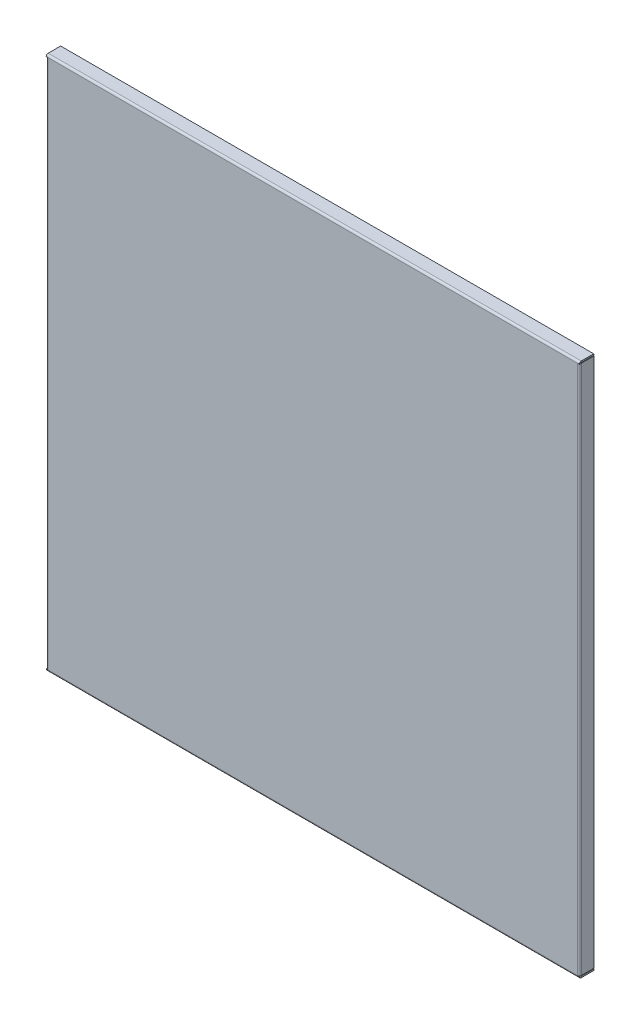
ISO-10303-21;
HEADER;
FILE_DESCRIPTION(('STEP AP214'),'2;1');
FILE_NAME('part.step','',(''),(''),'','','');
FILE_SCHEMA(('AUTOMOTIVE_DESIGN { 1 0 10303 214 1 1 1 1 }'));
ENDSEC;
DATA;
#1=APPLICATION_CONTEXT('core data for automotive mechanical design processes');
#2=APPLICATION_PROTOCOL_DEFINITION('international standard','automotive_design',2000,#1);
#3=PRODUCT_CONTEXT('',#1,'mechanical');
#4=PRODUCT('Part','Part','',(#3));
#5=PRODUCT_RELATED_PRODUCT_CATEGORY('part','',(#4));
#6=PRODUCT_DEFINITION_FORMATION('','',#4);
#7=PRODUCT_DEFINITION_CONTEXT('part definition',#1,'design');
#8=PRODUCT_DEFINITION('design','',#6,#7);
#9=PRODUCT_DEFINITION_SHAPE('','',#8);
#10=(LENGTH_UNIT() NAMED_UNIT(*) SI_UNIT(.MILLI.,.METRE.));
#11=(NAMED_UNIT(*) PLANE_ANGLE_UNIT() SI_UNIT($,.RADIAN.));
#12=(NAMED_UNIT(*) SI_UNIT($,.STERADIAN.) SOLID_ANGLE_UNIT());
#13=UNCERTAINTY_MEASURE_WITH_UNIT(LENGTH_MEASURE(1.E-05),#10,'distance_accuracy_value','');
#14=(GEOMETRIC_REPRESENTATION_CONTEXT(3) GLOBAL_UNCERTAINTY_ASSIGNED_CONTEXT((#13)) GLOBAL_UNIT_ASSIGNED_CONTEXT((#10,
#11,#12)) REPRESENTATION_CONTEXT('',''));
#15=CARTESIAN_POINT('',(0.,0.,0.));
#16=DIRECTION('',(0.,0.,1.));
#17=DIRECTION('',(1.,0.,0.));
#18=AXIS2_PLACEMENT_3D('',#15,#16,#17);
#19=CARTESIAN_POINT('',(277.5,-276.,-1.5));
#20=DIRECTION('',(0.,1.,0.));
#21=DIRECTION('',(0.,0.,1.));
#22=AXIS2_PLACEMENT_3D('',#19,#20,#21);
#23=PLANE('',#22);
#24=DIRECTION('',(-1.,0.,0.));
#25=VECTOR('',#24,1.);
#26=CARTESIAN_POINT('',(277.5,-276.,-1.5));
#27=LINE('',#26,#25);
#28=CARTESIAN_POINT('',(277.5,-276.,-1.5));
#29=VERTEX_POINT('',#28);
#30=CARTESIAN_POINT('',(277.436491673104,-276.,-1.5));
#31=VERTEX_POINT('',#30);
#32=EDGE_CURVE('E457',#29,#31,#27,.T.);
#33=ORIENTED_EDGE('',*,*,#32,.T.);
#34=CARTESIAN_POINT('',(275.5,-276.,-2.));
#35=DIRECTION('',(0.,-1.,0.));
#36=DIRECTION('',(0.,0.,-1.));
#37=AXIS2_PLACEMENT_3D('',#34,#35,#36);
#38=CIRCLE('',#37,2.);
#39=CARTESIAN_POINT('',(275.5,-276.,0.));
#40=VERTEX_POINT('',#39);
#41=EDGE_CURVE('E13',#31,#40,#38,.T.);
#42=ORIENTED_EDGE('',*,*,#41,.T.);
#43=DIRECTION('',(-1.,0.,0.));
#44=VECTOR('',#43,1.);
#45=CARTESIAN_POINT('',(-277.5,-276.,0.));
#46=LINE('',#45,#44);
#47=CARTESIAN_POINT('',(277.5,-276.,0.));
#48=VERTEX_POINT('',#47);
#49=EDGE_CURVE('E460',#48,#40,#46,.T.);
#50=ORIENTED_EDGE('',*,*,#49,.F.);
#51=DIRECTION('',(0.,0.,1.));
#52=VECTOR('',#51,1.);
#53=CARTESIAN_POINT('',(277.5,-276.,-1.5));
#54=LINE('',#53,#52);
#55=EDGE_CURVE('E507',#29,#48,#54,.T.);
#56=ORIENTED_EDGE('',*,*,#55,.F.);
#57=EDGE_LOOP('',(#33,#42,#50,#56));
#58=FACE_BOUND('',#57,.T.);
#59=ADVANCED_FACE('F119',(#58),#23,.T.);
#60=CARTESIAN_POINT('',(275.5,276.,-1.5));
#61=DIRECTION('',(0.,-1.,0.));
#62=DIRECTION('',(0.,0.,-1.));
#63=AXIS2_PLACEMENT_3D('',#60,#61,#62);
#64=PLANE('',#63);
#65=DIRECTION('',(1.,0.,0.));
#66=VECTOR('',#65,1.);
#67=CARTESIAN_POINT('',(277.5,276.,0.));
#68=LINE('',#67,#66);
#69=CARTESIAN_POINT('',(277.5,276.,0.));
#70=VERTEX_POINT('',#69);
#71=CARTESIAN_POINT('',(275.5,276.,0.));
#72=VERTEX_POINT('',#71);
#73=EDGE_CURVE('E535',#70,#72,#68,.F.);
#74=ORIENTED_EDGE('',*,*,#73,.T.);
#75=CARTESIAN_POINT('',(275.5,276.,-2.));
#76=DIRECTION('',(0.,-1.,0.));
#77=DIRECTION('',(0.,0.,-1.));
#78=AXIS2_PLACEMENT_3D('',#75,#76,#77);
#79=CIRCLE('',#78,2.);
#80=CARTESIAN_POINT('',(277.436491673104,276.,-1.5));
#81=VERTEX_POINT('',#80);
#82=EDGE_CURVE('E396',#72,#81,#79,.F.);
#83=ORIENTED_EDGE('',*,*,#82,.T.);
#84=DIRECTION('',(1.,0.,0.));
#85=VECTOR('',#84,1.);
#86=CARTESIAN_POINT('',(277.5,276.,-1.5));
#87=LINE('',#86,#85);
#88=CARTESIAN_POINT('',(277.5,276.,-1.5));
#89=VERTEX_POINT('',#88);
#90=EDGE_CURVE('E544',#89,#81,#87,.F.);
#91=ORIENTED_EDGE('',*,*,#90,.F.);
#92=DIRECTION('',(0.,0.,1.));
#93=VECTOR('',#92,1.);
#94=CARTESIAN_POINT('',(277.5,276.,-1.5));
#95=LINE('',#94,#93);
#96=EDGE_CURVE('E123',#89,#70,#95,.T.);
#97=ORIENTED_EDGE('',*,*,#96,.T.);
#98=EDGE_LOOP('',(#74,#83,#91,#97));
#99=FACE_BOUND('',#98,.T.);
#100=ADVANCED_FACE('F554',(#99),#64,.T.);
#101=CARTESIAN_POINT('',(-277.5,276.,-1.5));
#102=DIRECTION('',(0.,-1.,0.));
#103=DIRECTION('',(0.,0.,-1.));
#104=AXIS2_PLACEMENT_3D('',#101,#102,#103);
#105=PLANE('',#104);
#106=DIRECTION('',(1.,0.,0.));
#107=VECTOR('',#106,1.);
#108=CARTESIAN_POINT('',(-277.5,276.,-1.5));
#109=LINE('',#108,#107);
#110=CARTESIAN_POINT('',(-277.5,276.,-1.5));
#111=VERTEX_POINT('',#110);
#112=CARTESIAN_POINT('',(-277.436491673104,276.,-1.5));
#113=VERTEX_POINT('',#112);
#114=EDGE_CURVE('E464',#111,#113,#109,.T.);
#115=ORIENTED_EDGE('',*,*,#114,.T.);
#116=CARTESIAN_POINT('',(-275.5,276.,-2.));
#117=DIRECTION('',(0.,1.,0.));
#118=DIRECTION('',(0.,0.,1.));
#119=AXIS2_PLACEMENT_3D('',#116,#117,#118);
#120=CIRCLE('',#119,2.);
#121=CARTESIAN_POINT('',(-275.5,276.,0.));
#122=VERTEX_POINT('',#121);
#123=EDGE_CURVE('E128',#113,#122,#120,.T.);
#124=ORIENTED_EDGE('',*,*,#123,.T.);
#125=DIRECTION('',(1.,0.,0.));
#126=VECTOR('',#125,1.);
#127=CARTESIAN_POINT('',(277.5,276.,0.));
#128=LINE('',#127,#126);
#129=CARTESIAN_POINT('',(-277.5,276.,0.));
#130=VERTEX_POINT('',#129);
#131=EDGE_CURVE('E247',#130,#122,#128,.T.);
#132=ORIENTED_EDGE('',*,*,#131,.F.);
#133=DIRECTION('',(0.,0.,1.));
#134=VECTOR('',#133,1.);
#135=CARTESIAN_POINT('',(-277.5,276.,-1.5));
#136=LINE('',#135,#134);
#137=EDGE_CURVE('E550',#111,#130,#136,.T.);
#138=ORIENTED_EDGE('',*,*,#137,.F.);
#139=EDGE_LOOP('',(#115,#124,#132,#138));
#140=FACE_BOUND('',#139,.T.);
#141=ADVANCED_FACE('F594',(#140),#105,.T.);
#142=CARTESIAN_POINT('',(-275.5,-276.,-1.5));
#143=DIRECTION('',(0.,1.,0.));
#144=DIRECTION('',(0.,0.,1.));
#145=AXIS2_PLACEMENT_3D('',#142,#143,#144);
#146=PLANE('',#145);
#147=DIRECTION('',(-1.,0.,0.));
#148=VECTOR('',#147,1.);
#149=CARTESIAN_POINT('',(-277.5,-276.,0.));
#150=LINE('',#149,#148);
#151=CARTESIAN_POINT('',(-277.5,-276.,0.));
#152=VERTEX_POINT('',#151);
#153=CARTESIAN_POINT('',(-275.5,-276.,0.));
#154=VERTEX_POINT('',#153);
#155=EDGE_CURVE('E492',#152,#154,#150,.F.);
#156=ORIENTED_EDGE('',*,*,#155,.T.);
#157=CARTESIAN_POINT('',(-275.5,-276.,-2.));
#158=DIRECTION('',(0.,1.,0.));
#159=DIRECTION('',(0.,0.,1.));
#160=AXIS2_PLACEMENT_3D('',#157,#158,#159);
#161=CIRCLE('',#160,2.);
#162=CARTESIAN_POINT('',(-277.436491673104,-276.,-1.5));
#163=VERTEX_POINT('',#162);
#164=EDGE_CURVE('E446',#154,#163,#161,.F.);
#165=ORIENTED_EDGE('',*,*,#164,.T.);
#166=DIRECTION('',(-1.,0.,0.));
#167=VECTOR('',#166,1.);
#168=CARTESIAN_POINT('',(-277.5,-276.,-1.5));
#169=LINE('',#168,#167);
#170=CARTESIAN_POINT('',(-277.5,-276.,-1.5));
#171=VERTEX_POINT('',#170);
#172=EDGE_CURVE('E500',#171,#163,#169,.F.);
#173=ORIENTED_EDGE('',*,*,#172,.F.);
#174=DIRECTION('',(0.,0.,1.));
#175=VECTOR('',#174,1.);
#176=CARTESIAN_POINT('',(-277.5,-276.,-1.5));
#177=LINE('',#176,#175);
#178=EDGE_CURVE('E254',#171,#152,#177,.T.);
#179=ORIENTED_EDGE('',*,*,#178,.T.);
#180=EDGE_LOOP('',(#156,#165,#173,#179));
#181=FACE_BOUND('',#180,.T.);
#182=ADVANCED_FACE('F598',(#181),#146,.T.);
#183=CARTESIAN_POINT('',(0.,0.,-1.5));
#184=DIRECTION('',(0.,0.,1.));
#185=DIRECTION('',(1.,0.,0.));
#186=AXIS2_PLACEMENT_3D('',#183,#184,#185);
#187=PLANE('',#186);
#188=DIRECTION('',(0.,-1.,0.));
#189=VECTOR('',#188,1.);
#190=CARTESIAN_POINT('',(275.5,-276.,-1.5));
#191=LINE('',#190,#189);
#192=CARTESIAN_POINT('',(275.5,-276.,-1.5));
#193=VERTEX_POINT('',#192);
#194=CARTESIAN_POINT('',(275.5,276.,-1.5));
#195=VERTEX_POINT('',#194);
#196=EDGE_CURVE('E404',#193,#195,#191,.F.);
#197=ORIENTED_EDGE('',*,*,#196,.F.);
#198=CARTESIAN_POINT('',(-275.5,-276.,-1.5));
#199=VERTEX_POINT('',#198);
#200=EDGE_CURVE('E504',#199,#193,#169,.F.);
#201=ORIENTED_EDGE('',*,*,#200,.F.);
#202=DIRECTION('',(0.,1.,0.));
#203=VECTOR('',#202,1.);
#204=CARTESIAN_POINT('',(-275.5,276.,-1.5));
#205=LINE('',#204,#203);
#206=CARTESIAN_POINT('',(-275.5,276.,-1.5));
#207=VERTEX_POINT('',#206);
#208=EDGE_CURVE('E453',#207,#199,#205,.F.);
#209=ORIENTED_EDGE('',*,*,#208,.F.);
#210=EDGE_CURVE('E548',#195,#207,#87,.F.);
#211=ORIENTED_EDGE('',*,*,#210,.F.);
#212=EDGE_LOOP('',(#197,#201,#209,#211));
#213=FACE_BOUND('',#212,.T.);
#214=ADVANCED_FACE('F585',(#213),#187,.F.);
#215=CARTESIAN_POINT('',(0.,0.,0.));
#216=DIRECTION('',(0.,0.,1.));
#217=DIRECTION('',(1.,0.,0.));
#218=AXIS2_PLACEMENT_3D('',#215,#216,#217);
#219=PLANE('',#218);
#220=EDGE_CURVE('E495',#154,#40,#150,.F.);
#221=ORIENTED_EDGE('',*,*,#220,.T.);
#222=DIRECTION('',(0.,-1.,0.));
#223=VECTOR('',#222,1.);
#224=CARTESIAN_POINT('',(275.5,-276.,0.));
#225=LINE('',#224,#223);
#226=EDGE_CURVE('E392',#40,#72,#225,.F.);
#227=ORIENTED_EDGE('',*,*,#226,.T.);
#228=EDGE_CURVE('E539',#72,#122,#68,.F.);
#229=ORIENTED_EDGE('',*,*,#228,.T.);
#230=DIRECTION('',(0.,1.,0.));
#231=VECTOR('',#230,1.);
#232=CARTESIAN_POINT('',(-275.5,276.,0.));
#233=LINE('',#232,#231);
#234=EDGE_CURVE('E441',#122,#154,#233,.F.);
#235=ORIENTED_EDGE('',*,*,#234,.T.);
#236=EDGE_LOOP('',(#221,#227,#229,#235));
#237=FACE_BOUND('',#236,.T.);
#238=ADVANCED_FACE('F121',(#237),#219,.T.);
#239=CARTESIAN_POINT('',(-277.5,276.,-2.));
#240=DIRECTION('',(-1.,0.,0.));
#241=DIRECTION('',(0.,0.,1.));
#242=AXIS2_PLACEMENT_3D('',#239,#240,#241);
#243=PLANE('',#242);
#244=DIRECTION('',(0.,-1.,0.));
#245=VECTOR('',#244,1.);
#246=CARTESIAN_POINT('',(-277.5,278.,-2.));
#247=LINE('',#246,#245);
#248=CARTESIAN_POINT('',(-277.5,276.5,-2.));
#249=VERTEX_POINT('',#248);
#250=CARTESIAN_POINT('',(-277.5,278.,-2.));
#251=VERTEX_POINT('',#250);
#252=EDGE_CURVE('E159',#249,#251,#247,.F.);
#253=ORIENTED_EDGE('',*,*,#252,.F.);
#254=CARTESIAN_POINT('',(-277.5,276.,-2.));
#255=DIRECTION('',(1.,0.,0.));
#256=DIRECTION('',(0.,0.,-1.));
#257=AXIS2_PLACEMENT_3D('',#254,#255,#256);
#258=CIRCLE('',#257,0.5);
#259=EDGE_CURVE('E542',#111,#249,#258,.F.);
#260=ORIENTED_EDGE('',*,*,#259,.F.);
#261=ORIENTED_EDGE('',*,*,#137,.T.);
#262=CARTESIAN_POINT('',(-277.5,276.,-2.));
#263=DIRECTION('',(1.,0.,0.));
#264=DIRECTION('',(0.,0.,-1.));
#265=AXIS2_PLACEMENT_3D('',#262,#263,#264);
#266=CIRCLE('',#265,2.);
#267=EDGE_CURVE('E538',#130,#251,#266,.F.);
#268=ORIENTED_EDGE('',*,*,#267,.T.);
#269=EDGE_LOOP('',(#253,#260,#261,#268));
#270=FACE_BOUND('',#269,.T.);
#271=ADVANCED_FACE('F577',(#270),#243,.T.);
#272=CARTESIAN_POINT('',(277.5,276.,-2.));
#273=DIRECTION('',(-1.,0.,0.));
#274=DIRECTION('',(0.,0.,1.));
#275=AXIS2_PLACEMENT_3D('',#272,#273,#274);
#276=PLANE('',#275);
#277=CARTESIAN_POINT('',(277.5,276.,-2.));
#278=DIRECTION('',(1.,0.,0.));
#279=DIRECTION('',(0.,0.,-1.));
#280=AXIS2_PLACEMENT_3D('',#277,#278,#279);
#281=CIRCLE('',#280,0.5);
#282=CARTESIAN_POINT('',(277.5,276.5,-2.));
#283=VERTEX_POINT('',#282);
#284=EDGE_CURVE('E514',#283,#89,#281,.T.);
#285=ORIENTED_EDGE('',*,*,#284,.F.);
#286=DIRECTION('',(0.,-1.,0.));
#287=VECTOR('',#286,1.);
#288=CARTESIAN_POINT('',(277.5,276.5,-2.));
#289=LINE('',#288,#287);
#290=CARTESIAN_POINT('',(277.5,278.,-2.));
#291=VERTEX_POINT('',#290);
#292=EDGE_CURVE('E530',#283,#291,#289,.F.);
#293=ORIENTED_EDGE('',*,*,#292,.T.);
#294=CARTESIAN_POINT('',(277.5,276.,-2.));
#295=DIRECTION('',(1.,0.,0.));
#296=DIRECTION('',(0.,0.,-1.));
#297=AXIS2_PLACEMENT_3D('',#294,#295,#296);
#298=CIRCLE('',#297,2.);
#299=EDGE_CURVE('E188',#291,#70,#298,.T.);
#300=ORIENTED_EDGE('',*,*,#299,.T.);
#301=ORIENTED_EDGE('',*,*,#96,.F.);
#302=EDGE_LOOP('',(#285,#293,#300,#301));
#303=FACE_BOUND('',#302,.T.);
#304=ADVANCED_FACE('F560',(#303),#276,.F.);
#305=CARTESIAN_POINT('',(277.5,276.,-2.));
#306=DIRECTION('',(1.,0.,0.));
#307=DIRECTION('',(0.,1.,0.));
#308=AXIS2_PLACEMENT_3D('',#305,#306,#307);
#309=CYLINDRICAL_SURFACE('',#308,2.);
#310=ORIENTED_EDGE('',*,*,#73,.F.);
#311=ORIENTED_EDGE('',*,*,#299,.F.);
#312=DIRECTION('',(1.,0.,0.));
#313=VECTOR('',#312,1.);
#314=CARTESIAN_POINT('',(-277.5,278.,-2.));
#315=LINE('',#314,#313);
#316=EDGE_CURVE('E146',#291,#251,#315,.F.);
#317=ORIENTED_EDGE('',*,*,#316,.T.);
#318=ORIENTED_EDGE('',*,*,#267,.F.);
#319=ORIENTED_EDGE('',*,*,#131,.T.);
#320=ORIENTED_EDGE('',*,*,#228,.F.);
#321=EDGE_LOOP('',(#310,#311,#317,#318,#319,#320));
#322=FACE_BOUND('',#321,.T.);
#323=ADVANCED_FACE('F558',(#322),#309,.T.);
#324=CARTESIAN_POINT('',(277.5,276.,-2.));
#325=DIRECTION('',(1.,0.,0.));
#326=DIRECTION('',(0.,1.,0.));
#327=AXIS2_PLACEMENT_3D('',#324,#325,#326);
#328=CYLINDRICAL_SURFACE('',#327,0.5);
#329=ORIENTED_EDGE('',*,*,#90,.T.);
#330=EDGE_CURVE('E547',#81,#195,#87,.F.);
#331=ORIENTED_EDGE('',*,*,#330,.T.);
#332=ORIENTED_EDGE('',*,*,#210,.T.);
#333=EDGE_CURVE('E463',#113,#207,#109,.T.);
#334=ORIENTED_EDGE('',*,*,#333,.F.);
#335=ORIENTED_EDGE('',*,*,#114,.F.);
#336=ORIENTED_EDGE('',*,*,#259,.T.);
#337=DIRECTION('',(1.,0.,0.));
#338=VECTOR('',#337,1.);
#339=CARTESIAN_POINT('',(-277.5,276.5,-2.));
#340=LINE('',#339,#338);
#341=EDGE_CURVE('E532',#249,#283,#340,.T.);
#342=ORIENTED_EDGE('',*,*,#341,.T.);
#343=ORIENTED_EDGE('',*,*,#284,.T.);
#344=EDGE_LOOP('',(#329,#331,#332,#334,#335,#336,#342,#343));
#345=FACE_BOUND('',#344,.T.);
#346=ADVANCED_FACE('F574',(#345),#328,.F.);
#347=CARTESIAN_POINT('',(277.5,278.,-15.));
#348=DIRECTION('',(-1.,0.,0.));
#349=DIRECTION('',(0.,0.,1.));
#350=AXIS2_PLACEMENT_3D('',#347,#348,#349);
#351=PLANE('',#350);
#352=ORIENTED_EDGE('',*,*,#292,.F.);
#353=DIRECTION('',(0.,0.,1.));
#354=VECTOR('',#353,1.);
#355=CARTESIAN_POINT('',(277.5,276.5,-15.));
#356=LINE('',#355,#354);
#357=CARTESIAN_POINT('',(277.5,276.5,-15.));
#358=VERTEX_POINT('',#357);
#359=EDGE_CURVE('E183',#283,#358,#356,.F.);
#360=ORIENTED_EDGE('',*,*,#359,.T.);
#361=DIRECTION('',(0.,-1.,0.));
#362=VECTOR('',#361,1.);
#363=CARTESIAN_POINT('',(277.5,278.,-15.));
#364=LINE('',#363,#362);
#365=CARTESIAN_POINT('',(277.5,278.,-15.));
#366=VERTEX_POINT('',#365);
#367=EDGE_CURVE('E511',#366,#358,#364,.T.);
#368=ORIENTED_EDGE('',*,*,#367,.F.);
#369=DIRECTION('',(0.,0.,-1.));
#370=VECTOR('',#369,1.);
#371=CARTESIAN_POINT('',(277.5,278.,1.14835574365935E-12));
#372=LINE('',#371,#370);
#373=EDGE_CURVE('E521',#291,#366,#372,.T.);
#374=ORIENTED_EDGE('',*,*,#373,.F.);
#375=EDGE_LOOP('',(#352,#360,#368,#374));
#376=FACE_BOUND('',#375,.T.);
#377=ADVANCED_FACE('F564',(#376),#351,.F.);
#378=CARTESIAN_POINT('',(-277.5,278.,-1.49999999999999));
#379=DIRECTION('',(1.,0.,0.));
#380=DIRECTION('',(0.,0.,-1.));
#381=AXIS2_PLACEMENT_3D('',#378,#379,#380);
#382=PLANE('',#381);
#383=ORIENTED_EDGE('',*,*,#252,.T.);
#384=DIRECTION('',(0.,0.,1.));
#385=VECTOR('',#384,1.);
#386=CARTESIAN_POINT('',(-277.5,278.,1.14835574365935E-12));
#387=LINE('',#386,#385);
#388=CARTESIAN_POINT('',(-277.5,278.,-15.));
#389=VERTEX_POINT('',#388);
#390=EDGE_CURVE('E518',#389,#251,#387,.T.);
#391=ORIENTED_EDGE('',*,*,#390,.F.);
#392=DIRECTION('',(0.,-1.,0.));
#393=VECTOR('',#392,1.);
#394=CARTESIAN_POINT('',(-277.5,278.,-15.));
#395=LINE('',#394,#393);
#396=CARTESIAN_POINT('',(-277.5,276.5,-15.));
#397=VERTEX_POINT('',#396);
#398=EDGE_CURVE('E515',#389,#397,#395,.T.);
#399=ORIENTED_EDGE('',*,*,#398,.T.);
#400=DIRECTION('',(0.,0.,-1.));
#401=VECTOR('',#400,1.);
#402=CARTESIAN_POINT('',(-277.5,276.5,-1.5));
#403=LINE('',#402,#401);
#404=EDGE_CURVE('E523',#397,#249,#403,.F.);
#405=ORIENTED_EDGE('',*,*,#404,.T.);
#406=EDGE_LOOP('',(#383,#391,#399,#405));
#407=FACE_BOUND('',#406,.T.);
#408=ADVANCED_FACE('F569',(#407),#382,.F.);
#409=CARTESIAN_POINT('',(0.,278.,1.14835574365935E-12));
#410=DIRECTION('',(0.,-1.,0.));
#411=DIRECTION('',(0.,0.,-1.));
#412=AXIS2_PLACEMENT_3D('',#409,#410,#411);
#413=PLANE('',#412);
#414=ORIENTED_EDGE('',*,*,#316,.F.);
#415=ORIENTED_EDGE('',*,*,#373,.T.);
#416=DIRECTION('',(-1.,0.,0.));
#417=VECTOR('',#416,1.);
#418=CARTESIAN_POINT('',(0.,278.,-15.));
#419=LINE('',#418,#417);
#420=EDGE_CURVE('E168',#366,#389,#419,.T.);
#421=ORIENTED_EDGE('',*,*,#420,.T.);
#422=ORIENTED_EDGE('',*,*,#390,.T.);
#423=EDGE_LOOP('',(#414,#415,#421,#422));
#424=FACE_BOUND('',#423,.T.);
#425=ADVANCED_FACE('F562',(#424),#413,.F.);
#426=CARTESIAN_POINT('',(0.,276.5,1.14311852165109E-12));
#427=DIRECTION('',(0.,-1.,0.));
#428=DIRECTION('',(0.,0.,-1.));
#429=AXIS2_PLACEMENT_3D('',#426,#427,#428);
#430=PLANE('',#429);
#431=ORIENTED_EDGE('',*,*,#359,.F.);
#432=ORIENTED_EDGE('',*,*,#341,.F.);
#433=ORIENTED_EDGE('',*,*,#404,.F.);
#434=DIRECTION('',(1.,0.,0.));
#435=VECTOR('',#434,1.);
#436=CARTESIAN_POINT('',(-277.5,276.5,-15.));
#437=LINE('',#436,#435);
#438=EDGE_CURVE('E526',#358,#397,#437,.F.);
#439=ORIENTED_EDGE('',*,*,#438,.F.);
#440=EDGE_LOOP('',(#431,#432,#433,#439));
#441=FACE_BOUND('',#440,.T.);
#442=ADVANCED_FACE('F572',(#441),#430,.T.);
#443=CARTESIAN_POINT('',(-277.5,278.,-15.));
#444=DIRECTION('',(0.,0.,1.));
#445=DIRECTION('',(0.,-1.,0.));
#446=AXIS2_PLACEMENT_3D('',#443,#444,#445);
#447=PLANE('',#446);
#448=ORIENTED_EDGE('',*,*,#438,.T.);
#449=ORIENTED_EDGE('',*,*,#398,.F.);
#450=ORIENTED_EDGE('',*,*,#420,.F.);
#451=ORIENTED_EDGE('',*,*,#367,.T.);
#452=EDGE_LOOP('',(#448,#449,#450,#451));
#453=FACE_BOUND('',#452,.T.);
#454=ADVANCED_FACE('F566',(#453),#447,.F.);
#455=CARTESIAN_POINT('',(277.5,-276.,-2.));
#456=DIRECTION('',(1.,0.,0.));
#457=DIRECTION('',(0.,0.,-1.));
#458=AXIS2_PLACEMENT_3D('',#455,#456,#457);
#459=PLANE('',#458);
#460=DIRECTION('',(0.,1.,0.));
#461=VECTOR('',#460,1.);
#462=CARTESIAN_POINT('',(277.5,-278.,-2.));
#463=LINE('',#462,#461);
#464=CARTESIAN_POINT('',(277.5,-276.5,-2.));
#465=VERTEX_POINT('',#464);
#466=CARTESIAN_POINT('',(277.5,-278.,-2.));
#467=VERTEX_POINT('',#466);
#468=EDGE_CURVE('E210',#465,#467,#463,.F.);
#469=ORIENTED_EDGE('',*,*,#468,.F.);
#470=CARTESIAN_POINT('',(277.5,-276.,-2.));
#471=DIRECTION('',(-1.,0.,0.));
#472=DIRECTION('',(0.,0.,1.));
#473=AXIS2_PLACEMENT_3D('',#470,#471,#472);
#474=CIRCLE('',#473,0.5);
#475=EDGE_CURVE('E498',#29,#465,#474,.F.);
#476=ORIENTED_EDGE('',*,*,#475,.F.);
#477=ORIENTED_EDGE('',*,*,#55,.T.);
#478=CARTESIAN_POINT('',(277.5,-276.,-2.));
#479=DIRECTION('',(-1.,0.,0.));
#480=DIRECTION('',(0.,0.,1.));
#481=AXIS2_PLACEMENT_3D('',#478,#479,#480);
#482=CIRCLE('',#481,2.);
#483=EDGE_CURVE('E494',#48,#467,#482,.F.);
#484=ORIENTED_EDGE('',*,*,#483,.T.);
#485=EDGE_LOOP('',(#469,#476,#477,#484));
#486=FACE_BOUND('',#485,.T.);
#487=ADVANCED_FACE('F630',(#486),#459,.T.);
#488=CARTESIAN_POINT('',(-277.5,-276.,-2.));
#489=DIRECTION('',(1.,0.,0.));
#490=DIRECTION('',(0.,0.,-1.));
#491=AXIS2_PLACEMENT_3D('',#488,#489,#490);
#492=PLANE('',#491);
#493=CARTESIAN_POINT('',(-277.5,-276.,-2.));
#494=DIRECTION('',(-1.,0.,0.));
#495=DIRECTION('',(0.,0.,1.));
#496=AXIS2_PLACEMENT_3D('',#493,#494,#495);
#497=CIRCLE('',#496,0.5);
#498=CARTESIAN_POINT('',(-277.5,-276.5,-2.));
#499=VERTEX_POINT('',#498);
#500=EDGE_CURVE('E471',#499,#171,#497,.T.);
#501=ORIENTED_EDGE('',*,*,#500,.F.);
#502=DIRECTION('',(0.,1.,0.));
#503=VECTOR('',#502,1.);
#504=CARTESIAN_POINT('',(-277.5,-276.5,-2.));
#505=LINE('',#504,#503);
#506=CARTESIAN_POINT('',(-277.5,-278.,-2.));
#507=VERTEX_POINT('',#506);
#508=EDGE_CURVE('E487',#499,#507,#505,.F.);
#509=ORIENTED_EDGE('',*,*,#508,.T.);
#510=CARTESIAN_POINT('',(-277.5,-276.,-2.));
#511=DIRECTION('',(-1.,0.,0.));
#512=DIRECTION('',(0.,0.,1.));
#513=AXIS2_PLACEMENT_3D('',#510,#511,#512);
#514=CIRCLE('',#513,2.);
#515=EDGE_CURVE('E239',#507,#152,#514,.T.);
#516=ORIENTED_EDGE('',*,*,#515,.T.);
#517=ORIENTED_EDGE('',*,*,#178,.F.);
#518=EDGE_LOOP('',(#501,#509,#516,#517));
#519=FACE_BOUND('',#518,.T.);
#520=ADVANCED_FACE('F626',(#519),#492,.F.);
#521=CARTESIAN_POINT('',(-277.5,-276.,-2.));
#522=DIRECTION('',(-1.,0.,0.));
#523=DIRECTION('',(0.,-1.,0.));
#524=AXIS2_PLACEMENT_3D('',#521,#522,#523);
#525=CYLINDRICAL_SURFACE('',#524,2.);
#526=ORIENTED_EDGE('',*,*,#155,.F.);
#527=ORIENTED_EDGE('',*,*,#515,.F.);
#528=DIRECTION('',(-1.,0.,0.));
#529=VECTOR('',#528,1.);
#530=CARTESIAN_POINT('',(277.5,-278.,-2.));
#531=LINE('',#530,#529);
#532=EDGE_CURVE('E197',#507,#467,#531,.F.);
#533=ORIENTED_EDGE('',*,*,#532,.T.);
#534=ORIENTED_EDGE('',*,*,#483,.F.);
#535=ORIENTED_EDGE('',*,*,#49,.T.);
#536=ORIENTED_EDGE('',*,*,#220,.F.);
#537=EDGE_LOOP('',(#526,#527,#533,#534,#535,#536));
#538=FACE_BOUND('',#537,.T.);
#539=ADVANCED_FACE('F623',(#538),#525,.T.);
#540=CARTESIAN_POINT('',(-277.5,-276.,-2.));
#541=DIRECTION('',(-1.,0.,0.));
#542=DIRECTION('',(0.,-1.,0.));
#543=AXIS2_PLACEMENT_3D('',#540,#541,#542);
#544=CYLINDRICAL_SURFACE('',#543,0.5);
#545=ORIENTED_EDGE('',*,*,#172,.T.);
#546=EDGE_CURVE('E503',#163,#199,#169,.F.);
#547=ORIENTED_EDGE('',*,*,#546,.T.);
#548=ORIENTED_EDGE('',*,*,#200,.T.);
#549=EDGE_CURVE('E449',#31,#193,#27,.T.);
#550=ORIENTED_EDGE('',*,*,#549,.F.);
#551=ORIENTED_EDGE('',*,*,#32,.F.);
#552=ORIENTED_EDGE('',*,*,#475,.T.);
#553=DIRECTION('',(-1.,0.,0.));
#554=VECTOR('',#553,1.);
#555=CARTESIAN_POINT('',(277.5,-276.5,-2.));
#556=LINE('',#555,#554);
#557=EDGE_CURVE('E489',#465,#499,#556,.T.);
#558=ORIENTED_EDGE('',*,*,#557,.T.);
#559=ORIENTED_EDGE('',*,*,#500,.T.);
#560=EDGE_LOOP('',(#545,#547,#548,#550,#551,#552,#558,#559));
#561=FACE_BOUND('',#560,.T.);
#562=ADVANCED_FACE('F622',(#561),#544,.F.);
#563=CARTESIAN_POINT('',(-277.5,-278.,-15.));
#564=DIRECTION('',(1.,0.,0.));
#565=DIRECTION('',(0.,0.,-1.));
#566=AXIS2_PLACEMENT_3D('',#563,#564,#565);
#567=PLANE('',#566);
#568=ORIENTED_EDGE('',*,*,#508,.F.);
#569=DIRECTION('',(0.,0.,1.));
#570=VECTOR('',#569,1.);
#571=CARTESIAN_POINT('',(-277.5,-276.5,-15.));
#572=LINE('',#571,#570);
#573=CARTESIAN_POINT('',(-277.5,-276.5,-15.));
#574=VERTEX_POINT('',#573);
#575=EDGE_CURVE('E235',#499,#574,#572,.F.);
#576=ORIENTED_EDGE('',*,*,#575,.T.);
#577=DIRECTION('',(0.,1.,0.));
#578=VECTOR('',#577,1.);
#579=CARTESIAN_POINT('',(-277.5,-278.,-15.));
#580=LINE('',#579,#578);
#581=CARTESIAN_POINT('',(-277.5,-278.,-15.));
#582=VERTEX_POINT('',#581);
#583=EDGE_CURVE('E468',#582,#574,#580,.T.);
#584=ORIENTED_EDGE('',*,*,#583,.F.);
#585=DIRECTION('',(0.,0.,-1.));
#586=VECTOR('',#585,1.);
#587=CARTESIAN_POINT('',(-277.5,-278.,1.14835574365935E-12));
#588=LINE('',#587,#586);
#589=EDGE_CURVE('E478',#507,#582,#588,.T.);
#590=ORIENTED_EDGE('',*,*,#589,.F.);
#591=EDGE_LOOP('',(#568,#576,#584,#590));
#592=FACE_BOUND('',#591,.T.);
#593=ADVANCED_FACE('F614',(#592),#567,.F.);
#594=CARTESIAN_POINT('',(277.5,-278.,-1.49999999999999));
#595=DIRECTION('',(-1.,0.,0.));
#596=DIRECTION('',(0.,0.,1.));
#597=AXIS2_PLACEMENT_3D('',#594,#595,#596);
#598=PLANE('',#597);
#599=ORIENTED_EDGE('',*,*,#468,.T.);
#600=DIRECTION('',(0.,0.,1.));
#601=VECTOR('',#600,1.);
#602=CARTESIAN_POINT('',(277.5,-278.,1.14835574365935E-12));
#603=LINE('',#602,#601);
#604=CARTESIAN_POINT('',(277.5,-278.,-15.));
#605=VERTEX_POINT('',#604);
#606=EDGE_CURVE('E475',#605,#467,#603,.T.);
#607=ORIENTED_EDGE('',*,*,#606,.F.);
#608=DIRECTION('',(0.,1.,0.));
#609=VECTOR('',#608,1.);
#610=CARTESIAN_POINT('',(277.5,-278.,-15.));
#611=LINE('',#610,#609);
#612=CARTESIAN_POINT('',(277.5,-276.5,-15.));
#613=VERTEX_POINT('',#612);
#614=EDGE_CURVE('E472',#605,#613,#611,.T.);
#615=ORIENTED_EDGE('',*,*,#614,.T.);
#616=DIRECTION('',(0.,0.,-1.));
#617=VECTOR('',#616,1.);
#618=CARTESIAN_POINT('',(277.5,-276.5,-1.5));
#619=LINE('',#618,#617);
#620=EDGE_CURVE('E480',#613,#465,#619,.F.);
#621=ORIENTED_EDGE('',*,*,#620,.T.);
#622=EDGE_LOOP('',(#599,#607,#615,#621));
#623=FACE_BOUND('',#622,.T.);
#624=ADVANCED_FACE('F607',(#623),#598,.F.);
#625=CARTESIAN_POINT('',(0.,-278.,1.14835574365935E-12));
#626=DIRECTION('',(0.,1.,0.));
#627=DIRECTION('',(0.,0.,1.));
#628=AXIS2_PLACEMENT_3D('',#625,#626,#627);
#629=PLANE('',#628);
#630=ORIENTED_EDGE('',*,*,#532,.F.);
#631=ORIENTED_EDGE('',*,*,#589,.T.);
#632=DIRECTION('',(1.,0.,0.));
#633=VECTOR('',#632,1.);
#634=CARTESIAN_POINT('',(0.,-278.,-15.));
#635=LINE('',#634,#633);
#636=EDGE_CURVE('E220',#582,#605,#635,.T.);
#637=ORIENTED_EDGE('',*,*,#636,.T.);
#638=ORIENTED_EDGE('',*,*,#606,.T.);
#639=EDGE_LOOP('',(#630,#631,#637,#638));
#640=FACE_BOUND('',#639,.T.);
#641=ADVANCED_FACE('F603',(#640),#629,.F.);
#642=CARTESIAN_POINT('',(0.,-276.5,1.14311852165109E-12));
#643=DIRECTION('',(0.,1.,0.));
#644=DIRECTION('',(0.,0.,1.));
#645=AXIS2_PLACEMENT_3D('',#642,#643,#644);
#646=PLANE('',#645);
#647=ORIENTED_EDGE('',*,*,#575,.F.);
#648=ORIENTED_EDGE('',*,*,#557,.F.);
#649=ORIENTED_EDGE('',*,*,#620,.F.);
#650=DIRECTION('',(-1.,0.,0.));
#651=VECTOR('',#650,1.);
#652=CARTESIAN_POINT('',(277.5,-276.5,-15.));
#653=LINE('',#652,#651);
#654=EDGE_CURVE('E483',#574,#613,#653,.F.);
#655=ORIENTED_EDGE('',*,*,#654,.F.);
#656=EDGE_LOOP('',(#647,#648,#649,#655));
#657=FACE_BOUND('',#656,.T.);
#658=ADVANCED_FACE('F606',(#657),#646,.T.);
#659=CARTESIAN_POINT('',(277.5,-278.,-15.));
#660=DIRECTION('',(0.,0.,1.));
#661=DIRECTION('',(0.,-1.,0.));
#662=AXIS2_PLACEMENT_3D('',#659,#660,#661);
#663=PLANE('',#662);
#664=ORIENTED_EDGE('',*,*,#654,.T.);
#665=ORIENTED_EDGE('',*,*,#614,.F.);
#666=ORIENTED_EDGE('',*,*,#636,.F.);
#667=ORIENTED_EDGE('',*,*,#583,.T.);
#668=EDGE_LOOP('',(#664,#665,#666,#667));
#669=FACE_BOUND('',#668,.T.);
#670=ADVANCED_FACE('F610',(#669),#663,.F.);
#671=CARTESIAN_POINT('',(-275.5,-276.,-2.));
#672=DIRECTION('',(0.,-1.,0.));
#673=DIRECTION('',(0.,0.,-1.));
#674=AXIS2_PLACEMENT_3D('',#671,#672,#673);
#675=PLANE('',#674);
#676=ORIENTED_EDGE('',*,*,#546,.F.);
#677=CARTESIAN_POINT('',(-277.5,-276.,-2.));
#678=VERTEX_POINT('',#677);
#679=EDGE_CURVE('E444',#163,#678,#161,.F.);
#680=ORIENTED_EDGE('',*,*,#679,.T.);
#681=DIRECTION('',(1.,0.,0.));
#682=VECTOR('',#681,1.);
#683=CARTESIAN_POINT('',(-277.5,-276.,-2.));
#684=LINE('',#683,#682);
#685=CARTESIAN_POINT('',(-276.,-276.,-2.));
#686=VERTEX_POINT('',#685);
#687=EDGE_CURVE('E398',#686,#678,#684,.F.);
#688=ORIENTED_EDGE('',*,*,#687,.F.);
#689=CARTESIAN_POINT('',(-275.5,-276.,-2.));
#690=DIRECTION('',(0.,1.,0.));
#691=DIRECTION('',(0.,0.,1.));
#692=AXIS2_PLACEMENT_3D('',#689,#690,#691);
#693=CIRCLE('',#692,0.5);
#694=EDGE_CURVE('E137',#199,#686,#693,.F.);
#695=ORIENTED_EDGE('',*,*,#694,.F.);
#696=EDGE_LOOP('',(#676,#680,#688,#695));
#697=FACE_BOUND('',#696,.T.);
#698=ADVANCED_FACE('F618',(#697),#675,.T.);
#699=CARTESIAN_POINT('',(-275.5,276.,-2.));
#700=DIRECTION('',(0.,-1.,0.));
#701=DIRECTION('',(0.,0.,-1.));
#702=AXIS2_PLACEMENT_3D('',#699,#700,#701);
#703=PLANE('',#702);
#704=CARTESIAN_POINT('',(-277.5,276.,-2.));
#705=VERTEX_POINT('',#704);
#706=EDGE_CURVE('E445',#705,#113,#120,.T.);
#707=ORIENTED_EDGE('',*,*,#706,.T.);
#708=ORIENTED_EDGE('',*,*,#333,.T.);
#709=CARTESIAN_POINT('',(-275.5,276.,-2.));
#710=DIRECTION('',(0.,1.,0.));
#711=DIRECTION('',(0.,0.,1.));
#712=AXIS2_PLACEMENT_3D('',#709,#710,#711);
#713=CIRCLE('',#712,0.5);
#714=CARTESIAN_POINT('',(-276.,276.,-2.));
#715=VERTEX_POINT('',#714);
#716=EDGE_CURVE('E413',#715,#207,#713,.T.);
#717=ORIENTED_EDGE('',*,*,#716,.F.);
#718=DIRECTION('',(1.,0.,0.));
#719=VECTOR('',#718,1.);
#720=CARTESIAN_POINT('',(-276.,276.,-2.));
#721=LINE('',#720,#719);
#722=EDGE_CURVE('E434',#715,#705,#721,.F.);
#723=ORIENTED_EDGE('',*,*,#722,.T.);
#724=EDGE_LOOP('',(#707,#708,#717,#723));
#725=FACE_BOUND('',#724,.T.);
#726=ADVANCED_FACE('F714',(#725),#703,.F.);
#727=CARTESIAN_POINT('',(-275.5,276.,-2.));
#728=DIRECTION('',(0.,1.,0.));
#729=DIRECTION('',(-1.,0.,0.));
#730=AXIS2_PLACEMENT_3D('',#727,#728,#729);
#731=CYLINDRICAL_SURFACE('',#730,2.);
#732=ORIENTED_EDGE('',*,*,#234,.F.);
#733=ORIENTED_EDGE('',*,*,#123,.F.);
#734=ORIENTED_EDGE('',*,*,#706,.F.);
#735=DIRECTION('',(0.,1.,0.));
#736=VECTOR('',#735,1.);
#737=CARTESIAN_POINT('',(-277.5,-276.,-2.));
#738=LINE('',#737,#736);
#739=EDGE_CURVE('E431',#705,#678,#738,.F.);
#740=ORIENTED_EDGE('',*,*,#739,.T.);
#741=ORIENTED_EDGE('',*,*,#679,.F.);
#742=ORIENTED_EDGE('',*,*,#164,.F.);
#743=EDGE_LOOP('',(#732,#733,#734,#740,#741,#742));
#744=FACE_BOUND('',#743,.T.);
#745=ADVANCED_FACE('F721',(#744),#731,.T.);
#746=CARTESIAN_POINT('',(-275.5,276.,-2.));
#747=DIRECTION('',(0.,1.,0.));
#748=DIRECTION('',(-1.,0.,0.));
#749=AXIS2_PLACEMENT_3D('',#746,#747,#748);
#750=CYLINDRICAL_SURFACE('',#749,0.5);
#751=ORIENTED_EDGE('',*,*,#208,.T.);
#752=ORIENTED_EDGE('',*,*,#694,.T.);
#753=DIRECTION('',(0.,1.,0.));
#754=VECTOR('',#753,1.);
#755=CARTESIAN_POINT('',(-276.,-276.,-2.));
#756=LINE('',#755,#754);
#757=EDGE_CURVE('E437',#686,#715,#756,.T.);
#758=ORIENTED_EDGE('',*,*,#757,.T.);
#759=ORIENTED_EDGE('',*,*,#716,.T.);
#760=EDGE_LOOP('',(#751,#752,#758,#759));
#761=FACE_BOUND('',#760,.T.);
#762=ADVANCED_FACE('F728',(#761),#750,.F.);
#763=CARTESIAN_POINT('',(-277.5,276.,-15.));
#764=DIRECTION('',(0.,-1.,0.));
#765=DIRECTION('',(0.,0.,-1.));
#766=AXIS2_PLACEMENT_3D('',#763,#764,#765);
#767=PLANE('',#766);
#768=ORIENTED_EDGE('',*,*,#722,.F.);
#769=DIRECTION('',(0.,0.,1.));
#770=VECTOR('',#769,1.);
#771=CARTESIAN_POINT('',(-276.,276.,-15.));
#772=LINE('',#771,#770);
#773=CARTESIAN_POINT('',(-276.,276.,-15.));
#774=VERTEX_POINT('',#773);
#775=EDGE_CURVE('E429',#715,#774,#772,.F.);
#776=ORIENTED_EDGE('',*,*,#775,.T.);
#777=DIRECTION('',(1.,0.,0.));
#778=VECTOR('',#777,1.);
#779=CARTESIAN_POINT('',(-277.5,276.,-15.));
#780=LINE('',#779,#778);
#781=CARTESIAN_POINT('',(-277.5,276.,-15.));
#782=VERTEX_POINT('',#781);
#783=EDGE_CURVE('E410',#782,#774,#780,.T.);
#784=ORIENTED_EDGE('',*,*,#783,.F.);
#785=DIRECTION('',(0.,0.,-1.));
#786=VECTOR('',#785,1.);
#787=CARTESIAN_POINT('',(-277.5,276.,1.14629977509523E-12));
#788=LINE('',#787,#786);
#789=EDGE_CURVE('E422',#705,#782,#788,.T.);
#790=ORIENTED_EDGE('',*,*,#789,.F.);
#791=EDGE_LOOP('',(#768,#776,#784,#790));
#792=FACE_BOUND('',#791,.T.);
#793=ADVANCED_FACE('F736',(#792),#767,.F.);
#794=CARTESIAN_POINT('',(-277.5,-276.,-1.5));
#795=DIRECTION('',(0.,1.,0.));
#796=DIRECTION('',(0.,0.,1.));
#797=AXIS2_PLACEMENT_3D('',#794,#795,#796);
#798=PLANE('',#797);
#799=ORIENTED_EDGE('',*,*,#687,.T.);
#800=DIRECTION('',(0.,0.,1.));
#801=VECTOR('',#800,1.);
#802=CARTESIAN_POINT('',(-277.5,-276.,1.14629977509523E-12));
#803=LINE('',#802,#801);
#804=CARTESIAN_POINT('',(-277.5,-276.,-15.));
#805=VERTEX_POINT('',#804);
#806=EDGE_CURVE('E417',#805,#678,#803,.T.);
#807=ORIENTED_EDGE('',*,*,#806,.F.);
#808=DIRECTION('',(1.,0.,0.));
#809=VECTOR('',#808,1.);
#810=CARTESIAN_POINT('',(-277.5,-276.,-15.));
#811=LINE('',#810,#809);
#812=CARTESIAN_POINT('',(-276.,-276.,-15.));
#813=VERTEX_POINT('',#812);
#814=EDGE_CURVE('E414',#805,#813,#811,.T.);
#815=ORIENTED_EDGE('',*,*,#814,.T.);
#816=DIRECTION('',(0.,0.,-1.));
#817=VECTOR('',#816,1.);
#818=CARTESIAN_POINT('',(-276.,-276.,-1.5));
#819=LINE('',#818,#817);
#820=EDGE_CURVE('E424',#813,#686,#819,.F.);
#821=ORIENTED_EDGE('',*,*,#820,.T.);
#822=EDGE_LOOP('',(#799,#807,#815,#821));
#823=FACE_BOUND('',#822,.T.);
#824=ADVANCED_FACE('F744',(#823),#798,.F.);
#825=CARTESIAN_POINT('',(-277.5,0.,1.14629977509523E-12));
#826=DIRECTION('',(1.,0.,0.));
#827=DIRECTION('',(0.,0.,-1.));
#828=AXIS2_PLACEMENT_3D('',#825,#826,#827);
#829=PLANE('',#828);
#830=ORIENTED_EDGE('',*,*,#739,.F.);
#831=ORIENTED_EDGE('',*,*,#789,.T.);
#832=DIRECTION('',(0.,-1.,0.));
#833=VECTOR('',#832,1.);
#834=CARTESIAN_POINT('',(-277.5,0.,-15.));
#835=LINE('',#834,#833);
#836=EDGE_CURVE('E420',#782,#805,#835,.T.);
#837=ORIENTED_EDGE('',*,*,#836,.T.);
#838=ORIENTED_EDGE('',*,*,#806,.T.);
#839=EDGE_LOOP('',(#830,#831,#837,#838));
#840=FACE_BOUND('',#839,.T.);
#841=ADVANCED_FACE('F752',(#840),#829,.F.);
#842=CARTESIAN_POINT('',(-276.,0.,1.14106255308697E-12));
#843=DIRECTION('',(1.,0.,0.));
#844=DIRECTION('',(0.,0.,-1.));
#845=AXIS2_PLACEMENT_3D('',#842,#843,#844);
#846=PLANE('',#845);
#847=ORIENTED_EDGE('',*,*,#775,.F.);
#848=ORIENTED_EDGE('',*,*,#757,.F.);
#849=ORIENTED_EDGE('',*,*,#820,.F.);
#850=DIRECTION('',(0.,1.,0.));
#851=VECTOR('',#850,1.);
#852=CARTESIAN_POINT('',(-276.,-276.,-15.));
#853=LINE('',#852,#851);
#854=EDGE_CURVE('E427',#774,#813,#853,.F.);
#855=ORIENTED_EDGE('',*,*,#854,.F.);
#856=EDGE_LOOP('',(#847,#848,#849,#855));
#857=FACE_BOUND('',#856,.T.);
#858=ADVANCED_FACE('F760',(#857),#846,.T.);
#859=CARTESIAN_POINT('',(-277.5,-276.,-15.));
#860=DIRECTION('',(0.,0.,1.));
#861=DIRECTION('',(1.,0.,0.));
#862=AXIS2_PLACEMENT_3D('',#859,#860,#861);
#863=PLANE('',#862);
#864=ORIENTED_EDGE('',*,*,#854,.T.);
#865=ORIENTED_EDGE('',*,*,#814,.F.);
#866=ORIENTED_EDGE('',*,*,#836,.F.);
#867=ORIENTED_EDGE('',*,*,#783,.T.);
#868=EDGE_LOOP('',(#864,#865,#866,#867));
#869=FACE_BOUND('',#868,.T.);
#870=ADVANCED_FACE('F768',(#869),#863,.F.);
#871=CARTESIAN_POINT('',(275.5,276.,-2.));
#872=DIRECTION('',(0.,1.,0.));
#873=DIRECTION('',(0.,0.,1.));
#874=AXIS2_PLACEMENT_3D('',#871,#872,#873);
#875=PLANE('',#874);
#876=ORIENTED_EDGE('',*,*,#330,.F.);
#877=CARTESIAN_POINT('',(277.5,276.,-2.));
#878=VERTEX_POINT('',#877);
#879=EDGE_CURVE('E395',#81,#878,#79,.F.);
#880=ORIENTED_EDGE('',*,*,#879,.T.);
#881=DIRECTION('',(-1.,0.,0.));
#882=VECTOR('',#881,1.);
#883=CARTESIAN_POINT('',(277.5,276.,-2.));
#884=LINE('',#883,#882);
#885=CARTESIAN_POINT('',(276.,276.,-2.));
#886=VERTEX_POINT('',#885);
#887=EDGE_CURVE('E373',#886,#878,#884,.F.);
#888=ORIENTED_EDGE('',*,*,#887,.F.);
#889=CARTESIAN_POINT('',(275.5,276.,-2.));
#890=DIRECTION('',(0.,-1.,0.));
#891=DIRECTION('',(0.,0.,-1.));
#892=AXIS2_PLACEMENT_3D('',#889,#890,#891);
#893=CIRCLE('',#892,0.5);
#894=EDGE_CURVE('E401',#195,#886,#893,.F.);
#895=ORIENTED_EDGE('',*,*,#894,.F.);
#896=EDGE_LOOP('',(#876,#880,#888,#895));
#897=FACE_BOUND('',#896,.T.);
#898=ADVANCED_FACE('F776',(#897),#875,.T.);
#899=CARTESIAN_POINT('',(275.5,-276.,-2.));
#900=DIRECTION('',(0.,1.,0.));
#901=DIRECTION('',(0.,0.,1.));
#902=AXIS2_PLACEMENT_3D('',#899,#900,#901);
#903=PLANE('',#902);
#904=CARTESIAN_POINT('',(277.5,-276.,-2.));
#905=VERTEX_POINT('',#904);
#906=EDGE_CURVE('E130',#905,#31,#38,.T.);
#907=ORIENTED_EDGE('',*,*,#906,.T.);
#908=ORIENTED_EDGE('',*,*,#549,.T.);
#909=CARTESIAN_POINT('',(275.5,-276.,-2.));
#910=DIRECTION('',(0.,-1.,0.));
#911=DIRECTION('',(0.,0.,-1.));
#912=AXIS2_PLACEMENT_3D('',#909,#910,#911);
#913=CIRCLE('',#912,0.5);
#914=CARTESIAN_POINT('',(276.,-276.,-2.));
#915=VERTEX_POINT('',#914);
#916=EDGE_CURVE('E407',#915,#193,#913,.T.);
#917=ORIENTED_EDGE('',*,*,#916,.F.);
#918=DIRECTION('',(-1.,0.,0.));
#919=VECTOR('',#918,1.);
#920=CARTESIAN_POINT('',(276.,-276.,-2.));
#921=LINE('',#920,#919);
#922=EDGE_CURVE('E386',#915,#905,#921,.F.);
#923=ORIENTED_EDGE('',*,*,#922,.T.);
#924=EDGE_LOOP('',(#907,#908,#917,#923));
#925=FACE_BOUND('',#924,.T.);
#926=ADVANCED_FACE('F784',(#925),#903,.F.);
#927=CARTESIAN_POINT('',(275.5,-276.,-2.));
#928=DIRECTION('',(0.,-1.,0.));
#929=DIRECTION('',(1.,0.,0.));
#930=AXIS2_PLACEMENT_3D('',#927,#928,#929);
#931=CYLINDRICAL_SURFACE('',#930,2.);
#932=ORIENTED_EDGE('',*,*,#226,.F.);
#933=ORIENTED_EDGE('',*,*,#41,.F.);
#934=ORIENTED_EDGE('',*,*,#906,.F.);
#935=DIRECTION('',(0.,-1.,0.));
#936=VECTOR('',#935,1.);
#937=CARTESIAN_POINT('',(277.5,276.,-2.));
#938=LINE('',#937,#936);
#939=EDGE_CURVE('E383',#905,#878,#938,.F.);
#940=ORIENTED_EDGE('',*,*,#939,.T.);
#941=ORIENTED_EDGE('',*,*,#879,.F.);
#942=ORIENTED_EDGE('',*,*,#82,.F.);
#943=EDGE_LOOP('',(#932,#933,#934,#940,#941,#942));
#944=FACE_BOUND('',#943,.T.);
#945=ADVANCED_FACE('F792',(#944),#931,.T.);
#946=CARTESIAN_POINT('',(275.5,-276.,-2.));
#947=DIRECTION('',(0.,-1.,0.));
#948=DIRECTION('',(1.,0.,0.));
#949=AXIS2_PLACEMENT_3D('',#946,#947,#948);
#950=CYLINDRICAL_SURFACE('',#949,0.5);
#951=ORIENTED_EDGE('',*,*,#196,.T.);
#952=ORIENTED_EDGE('',*,*,#894,.T.);
#953=DIRECTION('',(0.,-1.,0.));
#954=VECTOR('',#953,1.);
#955=CARTESIAN_POINT('',(276.,276.,-2.));
#956=LINE('',#955,#954);
#957=EDGE_CURVE('E389',#886,#915,#956,.T.);
#958=ORIENTED_EDGE('',*,*,#957,.T.);
#959=ORIENTED_EDGE('',*,*,#916,.T.);
#960=EDGE_LOOP('',(#951,#952,#958,#959));
#961=FACE_BOUND('',#960,.T.);
#962=ADVANCED_FACE('F800',(#961),#950,.F.);
#963=CARTESIAN_POINT('',(277.5,-276.,-15.));
#964=DIRECTION('',(0.,1.,0.));
#965=DIRECTION('',(0.,0.,1.));
#966=AXIS2_PLACEMENT_3D('',#963,#964,#965);
#967=PLANE('',#966);
#968=ORIENTED_EDGE('',*,*,#922,.F.);
#969=DIRECTION('',(0.,0.,1.));
#970=VECTOR('',#969,1.);
#971=CARTESIAN_POINT('',(276.,-276.,-15.));
#972=LINE('',#971,#970);
#973=CARTESIAN_POINT('',(276.,-276.,-15.));
#974=VERTEX_POINT('',#973);
#975=EDGE_CURVE('E381',#915,#974,#972,.F.);
#976=ORIENTED_EDGE('',*,*,#975,.T.);
#977=DIRECTION('',(-1.,0.,0.));
#978=VECTOR('',#977,1.);
#979=CARTESIAN_POINT('',(277.5,-276.,-15.));
#980=LINE('',#979,#978);
#981=CARTESIAN_POINT('',(277.5,-276.,-15.));
#982=VERTEX_POINT('',#981);
#983=EDGE_CURVE('E369',#982,#974,#980,.T.);
#984=ORIENTED_EDGE('',*,*,#983,.F.);
#985=DIRECTION('',(0.,0.,-1.));
#986=VECTOR('',#985,1.);
#987=CARTESIAN_POINT('',(277.5,-276.,1.14629977509523E-12));
#988=LINE('',#987,#986);
#989=EDGE_CURVE('E356',#905,#982,#988,.T.);
#990=ORIENTED_EDGE('',*,*,#989,.F.);
#991=EDGE_LOOP('',(#968,#976,#984,#990));
#992=FACE_BOUND('',#991,.T.);
#993=ADVANCED_FACE('F808',(#992),#967,.F.);
#994=CARTESIAN_POINT('',(277.5,276.,-1.5));
#995=DIRECTION('',(0.,-1.,0.));
#996=DIRECTION('',(0.,0.,-1.));
#997=AXIS2_PLACEMENT_3D('',#994,#995,#996);
#998=PLANE('',#997);
#999=ORIENTED_EDGE('',*,*,#887,.T.);
#1000=DIRECTION('',(0.,0.,1.));
#1001=VECTOR('',#1000,1.);
#1002=CARTESIAN_POINT('',(277.5,276.,1.14629977509523E-12));
#1003=LINE('',#1002,#1001);
#1004=CARTESIAN_POINT('',(277.5,276.,-15.));
#1005=VERTEX_POINT('',#1004);
#1006=EDGE_CURVE('E354',#1005,#878,#1003,.T.);
#1007=ORIENTED_EDGE('',*,*,#1006,.F.);
#1008=DIRECTION('',(-1.,0.,0.));
#1009=VECTOR('',#1008,1.);
#1010=CARTESIAN_POINT('',(277.5,276.,-15.));
#1011=LINE('',#1010,#1009);
#1012=CARTESIAN_POINT('',(276.,276.,-15.));
#1013=VERTEX_POINT('',#1012);
#1014=EDGE_CURVE('E362',#1005,#1013,#1011,.T.);
#1015=ORIENTED_EDGE('',*,*,#1014,.T.);
#1016=DIRECTION('',(0.,0.,-1.));
#1017=VECTOR('',#1016,1.);
#1018=CARTESIAN_POINT('',(276.,276.,-1.5));
#1019=LINE('',#1018,#1017);
#1020=EDGE_CURVE('E378',#1013,#886,#1019,.F.);
#1021=ORIENTED_EDGE('',*,*,#1020,.T.);
#1022=EDGE_LOOP('',(#999,#1007,#1015,#1021));
#1023=FACE_BOUND('',#1022,.T.);
#1024=ADVANCED_FACE('F372',(#1023),#998,.F.);
#1025=CARTESIAN_POINT('',(277.5,0.,1.14629977509523E-12));
#1026=DIRECTION('',(-1.,0.,0.));
#1027=DIRECTION('',(0.,0.,1.));
#1028=AXIS2_PLACEMENT_3D('',#1025,#1026,#1027);
#1029=PLANE('',#1028);
#1030=ORIENTED_EDGE('',*,*,#939,.F.);
#1031=ORIENTED_EDGE('',*,*,#989,.T.);
#1032=DIRECTION('',(0.,1.,0.));
#1033=VECTOR('',#1032,1.);
#1034=CARTESIAN_POINT('',(277.5,0.,-15.));
#1035=LINE('',#1034,#1033);
#1036=EDGE_CURVE('E349',#982,#1005,#1035,.T.);
#1037=ORIENTED_EDGE('',*,*,#1036,.T.);
#1038=ORIENTED_EDGE('',*,*,#1006,.T.);
#1039=EDGE_LOOP('',(#1030,#1031,#1037,#1038));
#1040=FACE_BOUND('',#1039,.T.);
#1041=ADVANCED_FACE('F352',(#1040),#1029,.F.);
#1042=CARTESIAN_POINT('',(276.,0.,1.14106255308697E-12));
#1043=DIRECTION('',(-1.,0.,0.));
#1044=DIRECTION('',(0.,0.,1.));
#1045=AXIS2_PLACEMENT_3D('',#1042,#1043,#1044);
#1046=PLANE('',#1045);
#1047=ORIENTED_EDGE('',*,*,#975,.F.);
#1048=ORIENTED_EDGE('',*,*,#957,.F.);
#1049=ORIENTED_EDGE('',*,*,#1020,.F.);
#1050=DIRECTION('',(0.,-1.,0.));
#1051=VECTOR('',#1050,1.);
#1052=CARTESIAN_POINT('',(276.,276.,-15.));
#1053=LINE('',#1052,#1051);
#1054=EDGE_CURVE('E365',#974,#1013,#1053,.F.);
#1055=ORIENTED_EDGE('',*,*,#1054,.F.);
#1056=EDGE_LOOP('',(#1047,#1048,#1049,#1055));
#1057=FACE_BOUND('',#1056,.T.);
#1058=ADVANCED_FACE('F829',(#1057),#1046,.T.);
#1059=CARTESIAN_POINT('',(277.5,276.,-15.));
#1060=DIRECTION('',(0.,0.,1.));
#1061=DIRECTION('',(1.,0.,0.));
#1062=AXIS2_PLACEMENT_3D('',#1059,#1060,#1061);
#1063=PLANE('',#1062);
#1064=ORIENTED_EDGE('',*,*,#1054,.T.);
#1065=ORIENTED_EDGE('',*,*,#1014,.F.);
#1066=ORIENTED_EDGE('',*,*,#1036,.F.);
#1067=ORIENTED_EDGE('',*,*,#983,.T.);
#1068=EDGE_LOOP('',(#1064,#1065,#1066,#1067));
#1069=FACE_BOUND('',#1068,.T.);
#1070=ADVANCED_FACE('F363',(#1069),#1063,.F.);
#1071=CLOSED_SHELL('',(#59,#100,#141,#182,#214,#238,#271,#304,#323,#346,#377,#408,#425,#442,
#454,#487,#520,#539,#562,#593,#624,#641,#658,#670,#698,#726,#745,#762,#793,#824,#841,#858,#870,
#898,#926,#945,#962,#993,#1024,#1041,#1058,#1070));
#1072=MANIFOLD_SOLID_BREP('B2',#1071);
#1073=ADVANCED_BREP_SHAPE_REPRESENTATION('',(#18,#1072),#14);
#1074=SHAPE_DEFINITION_REPRESENTATION(#9,#1073);
ENDSEC;
END-ISO-10303-21;
